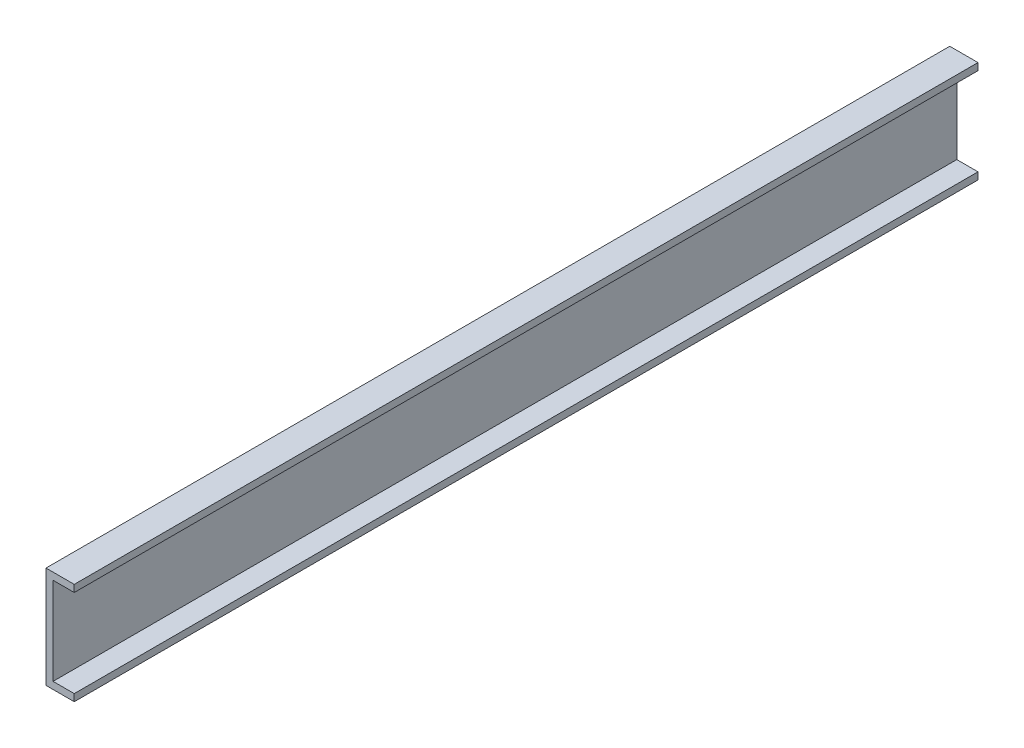
ISO-10303-21;
HEADER;
FILE_DESCRIPTION(('STEP AP214'),'2;1');
FILE_NAME('part.step','',(''),(''),'','','');
FILE_SCHEMA(('AUTOMOTIVE_DESIGN { 1 0 10303 214 1 1 1 1 }'));
ENDSEC;
DATA;
#1=APPLICATION_CONTEXT('core data for automotive mechanical design processes');
#2=APPLICATION_PROTOCOL_DEFINITION('international standard','automotive_design',2000,#1);
#3=PRODUCT_CONTEXT('',#1,'mechanical');
#4=PRODUCT('Part','Part','',(#3));
#5=PRODUCT_RELATED_PRODUCT_CATEGORY('part','',(#4));
#6=PRODUCT_DEFINITION_FORMATION('','',#4);
#7=PRODUCT_DEFINITION_CONTEXT('part definition',#1,'design');
#8=PRODUCT_DEFINITION('design','',#6,#7);
#9=PRODUCT_DEFINITION_SHAPE('','',#8);
#10=(LENGTH_UNIT() NAMED_UNIT(*) SI_UNIT(.MILLI.,.METRE.));
#11=(NAMED_UNIT(*) PLANE_ANGLE_UNIT() SI_UNIT($,.RADIAN.));
#12=(NAMED_UNIT(*) SI_UNIT($,.STERADIAN.) SOLID_ANGLE_UNIT());
#13=UNCERTAINTY_MEASURE_WITH_UNIT(LENGTH_MEASURE(1.E-05),#10,'distance_accuracy_value','');
#14=(GEOMETRIC_REPRESENTATION_CONTEXT(3) GLOBAL_UNCERTAINTY_ASSIGNED_CONTEXT((#13)) GLOBAL_UNIT_ASSIGNED_CONTEXT((#10,
#11,#12)) REPRESENTATION_CONTEXT('',''));
#15=CARTESIAN_POINT('',(0.,0.,0.));
#16=DIRECTION('',(0.,0.,1.));
#17=DIRECTION('',(1.,0.,0.));
#18=AXIS2_PLACEMENT_3D('',#15,#16,#17);
#19=CARTESIAN_POINT('',(12.7,0.,0.));
#20=DIRECTION('',(-1.,0.,0.));
#21=DIRECTION('',(0.,0.,1.));
#22=AXIS2_PLACEMENT_3D('',#19,#20,#21);
#23=PLANE('',#22);
#24=DIRECTION('',(0.,1.,0.));
#25=VECTOR('',#24,1.);
#26=CARTESIAN_POINT('',(12.7,0.,-406.4));
#27=LINE('',#26,#25);
#28=CARTESIAN_POINT('',(12.7,0.,-406.4));
#29=VERTEX_POINT('',#28);
#30=CARTESIAN_POINT('',(12.7,3.175,-406.4));
#31=VERTEX_POINT('',#30);
#32=EDGE_CURVE('E166',#29,#31,#27,.T.);
#33=ORIENTED_EDGE('',*,*,#32,.T.);
#34=DIRECTION('',(0.,0.,1.));
#35=VECTOR('',#34,1.);
#36=CARTESIAN_POINT('',(12.7,3.175,-406.4));
#37=LINE('',#36,#35);
#38=CARTESIAN_POINT('',(12.7,3.175,0.));
#39=VERTEX_POINT('',#38);
#40=EDGE_CURVE('E152',#31,#39,#37,.T.);
#41=ORIENTED_EDGE('',*,*,#40,.T.);
#42=DIRECTION('',(0.,-1.,0.));
#43=VECTOR('',#42,1.);
#44=CARTESIAN_POINT('',(12.7,0.,0.));
#45=LINE('',#44,#43);
#46=CARTESIAN_POINT('',(12.7,0.,0.));
#47=VERTEX_POINT('',#46);
#48=EDGE_CURVE('E93',#39,#47,#45,.T.);
#49=ORIENTED_EDGE('',*,*,#48,.T.);
#50=DIRECTION('',(0.,0.,-1.));
#51=VECTOR('',#50,1.);
#52=CARTESIAN_POINT('',(12.7,0.,0.));
#53=LINE('',#52,#51);
#54=EDGE_CURVE('E163',#47,#29,#53,.T.);
#55=ORIENTED_EDGE('',*,*,#54,.T.);
#56=EDGE_LOOP('',(#33,#41,#49,#55));
#57=FACE_BOUND('',#56,.T.);
#58=ADVANCED_FACE('F39',(#57),#23,.F.);
#59=CARTESIAN_POINT('',(12.7,0.,0.));
#60=DIRECTION('',(0.,0.,-1.));
#61=DIRECTION('',(-1.,0.,0.));
#62=AXIS2_PLACEMENT_3D('',#59,#60,#61);
#63=PLANE('',#62);
#64=ORIENTED_EDGE('',*,*,#48,.F.);
#65=DIRECTION('',(1.,0.,0.));
#66=VECTOR('',#65,1.);
#67=CARTESIAN_POINT('',(12.7,3.175,0.));
#68=LINE('',#67,#66);
#69=CARTESIAN_POINT('',(3.175,3.175,0.));
#70=VERTEX_POINT('',#69);
#71=EDGE_CURVE('E140',#70,#39,#68,.T.);
#72=ORIENTED_EDGE('',*,*,#71,.F.);
#73=DIRECTION('',(0.,-1.,0.));
#74=VECTOR('',#73,1.);
#75=CARTESIAN_POINT('',(3.175,42.545,0.));
#76=LINE('',#75,#74);
#77=CARTESIAN_POINT('',(3.175,42.545,0.));
#78=VERTEX_POINT('',#77);
#79=EDGE_CURVE('E143',#78,#70,#76,.T.);
#80=ORIENTED_EDGE('',*,*,#79,.F.);
#81=DIRECTION('',(-1.,0.,0.));
#82=VECTOR('',#81,1.);
#83=CARTESIAN_POINT('',(12.7,42.545,0.));
#84=LINE('',#83,#82);
#85=CARTESIAN_POINT('',(12.7,42.545,0.));
#86=VERTEX_POINT('',#85);
#87=EDGE_CURVE('E118',#86,#78,#84,.T.);
#88=ORIENTED_EDGE('',*,*,#87,.F.);
#89=CARTESIAN_POINT('',(12.7,45.72,0.));
#90=VERTEX_POINT('',#89);
#91=EDGE_CURVE('E160',#90,#86,#45,.T.);
#92=ORIENTED_EDGE('',*,*,#91,.F.);
#93=DIRECTION('',(-1.,0.,0.));
#94=VECTOR('',#93,1.);
#95=CARTESIAN_POINT('',(12.7,45.72,0.));
#96=LINE('',#95,#94);
#97=CARTESIAN_POINT('',(0.,45.72,0.));
#98=VERTEX_POINT('',#97);
#99=EDGE_CURVE('E172',#90,#98,#96,.T.);
#100=ORIENTED_EDGE('',*,*,#99,.T.);
#101=DIRECTION('',(0.,-1.,0.));
#102=VECTOR('',#101,1.);
#103=CARTESIAN_POINT('',(0.,0.,0.));
#104=LINE('',#103,#102);
#105=CARTESIAN_POINT('',(0.,0.,0.));
#106=VERTEX_POINT('',#105);
#107=EDGE_CURVE('E155',#98,#106,#104,.T.);
#108=ORIENTED_EDGE('',*,*,#107,.T.);
#109=DIRECTION('',(-1.,0.,0.));
#110=VECTOR('',#109,1.);
#111=CARTESIAN_POINT('',(12.7,0.,0.));
#112=LINE('',#111,#110);
#113=EDGE_CURVE('E11',#47,#106,#112,.T.);
#114=ORIENTED_EDGE('',*,*,#113,.F.);
#115=EDGE_LOOP('',(#64,#72,#80,#88,#92,#100,#108,#114));
#116=FACE_BOUND('',#115,.T.);
#117=ADVANCED_FACE('F41',(#116),#63,.F.);
#118=CARTESIAN_POINT('',(12.7,0.,0.));
#119=DIRECTION('',(0.,1.,0.));
#120=DIRECTION('',(0.,0.,1.));
#121=AXIS2_PLACEMENT_3D('',#118,#119,#120);
#122=PLANE('',#121);
#123=DIRECTION('',(0.,0.,-1.));
#124=VECTOR('',#123,1.);
#125=CARTESIAN_POINT('',(0.,0.,0.));
#126=LINE('',#125,#124);
#127=CARTESIAN_POINT('',(0.,0.,-406.4));
#128=VERTEX_POINT('',#127);
#129=EDGE_CURVE('E176',#106,#128,#126,.T.);
#130=ORIENTED_EDGE('',*,*,#129,.T.);
#131=DIRECTION('',(-1.,0.,0.));
#132=VECTOR('',#131,1.);
#133=CARTESIAN_POINT('',(12.7,0.,-406.4));
#134=LINE('',#133,#132);
#135=EDGE_CURVE('E48',#29,#128,#134,.T.);
#136=ORIENTED_EDGE('',*,*,#135,.F.);
#137=ORIENTED_EDGE('',*,*,#54,.F.);
#138=ORIENTED_EDGE('',*,*,#113,.T.);
#139=EDGE_LOOP('',(#130,#136,#137,#138));
#140=FACE_BOUND('',#139,.T.);
#141=ADVANCED_FACE('F209',(#140),#122,.F.);
#142=CARTESIAN_POINT('',(12.7,0.,-406.4));
#143=DIRECTION('',(0.,0.,1.));
#144=DIRECTION('',(1.,0.,0.));
#145=AXIS2_PLACEMENT_3D('',#142,#143,#144);
#146=PLANE('',#145);
#147=DIRECTION('',(0.,-1.,0.));
#148=VECTOR('',#147,1.);
#149=CARTESIAN_POINT('',(3.175,42.545,-406.4));
#150=LINE('',#149,#148);
#151=CARTESIAN_POINT('',(3.175,42.545,-406.4));
#152=VERTEX_POINT('',#151);
#153=CARTESIAN_POINT('',(3.175,3.175,-406.4));
#154=VERTEX_POINT('',#153);
#155=EDGE_CURVE('E127',#152,#154,#150,.T.);
#156=ORIENTED_EDGE('',*,*,#155,.T.);
#157=DIRECTION('',(1.,0.,0.));
#158=VECTOR('',#157,1.);
#159=CARTESIAN_POINT('',(12.7,3.175,-406.4));
#160=LINE('',#159,#158);
#161=EDGE_CURVE('E133',#154,#31,#160,.T.);
#162=ORIENTED_EDGE('',*,*,#161,.T.);
#163=ORIENTED_EDGE('',*,*,#32,.F.);
#164=ORIENTED_EDGE('',*,*,#135,.T.);
#165=DIRECTION('',(0.,1.,0.));
#166=VECTOR('',#165,1.);
#167=CARTESIAN_POINT('',(0.,0.,-406.4));
#168=LINE('',#167,#166);
#169=CARTESIAN_POINT('',(0.,45.72,-406.4));
#170=VERTEX_POINT('',#169);
#171=EDGE_CURVE('E179',#128,#170,#168,.T.);
#172=ORIENTED_EDGE('',*,*,#171,.T.);
#173=DIRECTION('',(-1.,0.,0.));
#174=VECTOR('',#173,1.);
#175=CARTESIAN_POINT('',(12.7,45.72,-406.4));
#176=LINE('',#175,#174);
#177=CARTESIAN_POINT('',(12.7,45.72,-406.4));
#178=VERTEX_POINT('',#177);
#179=EDGE_CURVE('E186',#178,#170,#176,.T.);
#180=ORIENTED_EDGE('',*,*,#179,.F.);
#181=CARTESIAN_POINT('',(12.7,42.545,-406.4));
#182=VERTEX_POINT('',#181);
#183=EDGE_CURVE('E138',#182,#178,#27,.T.);
#184=ORIENTED_EDGE('',*,*,#183,.F.);
#185=DIRECTION('',(-1.,0.,0.));
#186=VECTOR('',#185,1.);
#187=CARTESIAN_POINT('',(12.7,42.545,-406.4));
#188=LINE('',#187,#186);
#189=EDGE_CURVE('E55',#182,#152,#188,.T.);
#190=ORIENTED_EDGE('',*,*,#189,.T.);
#191=EDGE_LOOP('',(#156,#162,#163,#164,#172,#180,#184,#190));
#192=FACE_BOUND('',#191,.T.);
#193=ADVANCED_FACE('F136',(#192),#146,.F.);
#194=CARTESIAN_POINT('',(12.7,45.72,0.));
#195=DIRECTION('',(0.,-1.,0.));
#196=DIRECTION('',(0.,0.,-1.));
#197=AXIS2_PLACEMENT_3D('',#194,#195,#196);
#198=PLANE('',#197);
#199=DIRECTION('',(0.,0.,1.));
#200=VECTOR('',#199,1.);
#201=CARTESIAN_POINT('',(0.,45.72,0.));
#202=LINE('',#201,#200);
#203=EDGE_CURVE('E85',#170,#98,#202,.T.);
#204=ORIENTED_EDGE('',*,*,#203,.T.);
#205=ORIENTED_EDGE('',*,*,#99,.F.);
#206=DIRECTION('',(0.,0.,1.));
#207=VECTOR('',#206,1.);
#208=CARTESIAN_POINT('',(12.7,45.72,0.));
#209=LINE('',#208,#207);
#210=EDGE_CURVE('E64',#178,#90,#209,.T.);
#211=ORIENTED_EDGE('',*,*,#210,.F.);
#212=ORIENTED_EDGE('',*,*,#179,.T.);
#213=EDGE_LOOP('',(#204,#205,#211,#212));
#214=FACE_BOUND('',#213,.T.);
#215=ADVANCED_FACE('F200',(#214),#198,.F.);
#216=ORIENTED_EDGE('',*,*,#91,.T.);
#217=DIRECTION('',(0.,0.,1.));
#218=VECTOR('',#217,1.);
#219=CARTESIAN_POINT('',(12.7,42.545,-406.4));
#220=LINE('',#219,#218);
#221=EDGE_CURVE('E124',#182,#86,#220,.T.);
#222=ORIENTED_EDGE('',*,*,#221,.F.);
#223=ORIENTED_EDGE('',*,*,#183,.T.);
#224=ORIENTED_EDGE('',*,*,#210,.T.);
#225=EDGE_LOOP('',(#216,#222,#223,#224));
#226=FACE_BOUND('',#225,.T.);
#227=ADVANCED_FACE('F202',(#226),#23,.F.);
#228=CARTESIAN_POINT('',(0.,0.,0.));
#229=DIRECTION('',(-1.,0.,0.));
#230=DIRECTION('',(0.,0.,1.));
#231=AXIS2_PLACEMENT_3D('',#228,#229,#230);
#232=PLANE('',#231);
#233=ORIENTED_EDGE('',*,*,#107,.F.);
#234=ORIENTED_EDGE('',*,*,#203,.F.);
#235=ORIENTED_EDGE('',*,*,#171,.F.);
#236=ORIENTED_EDGE('',*,*,#129,.F.);
#237=EDGE_LOOP('',(#233,#234,#235,#236));
#238=FACE_BOUND('',#237,.T.);
#239=ADVANCED_FACE('F196',(#238),#232,.T.);
#240=CARTESIAN_POINT('',(12.7,3.175,-406.4));
#241=DIRECTION('',(0.,-1.,0.));
#242=DIRECTION('',(1.,0.,0.));
#243=AXIS2_PLACEMENT_3D('',#240,#241,#242);
#244=PLANE('',#243);
#245=ORIENTED_EDGE('',*,*,#71,.T.);
#246=ORIENTED_EDGE('',*,*,#40,.F.);
#247=ORIENTED_EDGE('',*,*,#161,.F.);
#248=DIRECTION('',(0.,0.,1.));
#249=VECTOR('',#248,1.);
#250=CARTESIAN_POINT('',(3.175,3.175,-406.4));
#251=LINE('',#250,#249);
#252=EDGE_CURVE('E123',#154,#70,#251,.T.);
#253=ORIENTED_EDGE('',*,*,#252,.T.);
#254=EDGE_LOOP('',(#245,#246,#247,#253));
#255=FACE_BOUND('',#254,.T.);
#256=ADVANCED_FACE('F219',(#255),#244,.F.);
#257=CARTESIAN_POINT('',(3.175,42.545,-406.4));
#258=DIRECTION('',(-1.,0.,0.));
#259=DIRECTION('',(0.,-1.,0.));
#260=AXIS2_PLACEMENT_3D('',#257,#258,#259);
#261=PLANE('',#260);
#262=ORIENTED_EDGE('',*,*,#79,.T.);
#263=ORIENTED_EDGE('',*,*,#252,.F.);
#264=ORIENTED_EDGE('',*,*,#155,.F.);
#265=DIRECTION('',(0.,0.,1.));
#266=VECTOR('',#265,1.);
#267=CARTESIAN_POINT('',(3.175,42.545,-406.4));
#268=LINE('',#267,#266);
#269=EDGE_CURVE('E114',#152,#78,#268,.T.);
#270=ORIENTED_EDGE('',*,*,#269,.T.);
#271=EDGE_LOOP('',(#262,#263,#264,#270));
#272=FACE_BOUND('',#271,.T.);
#273=ADVANCED_FACE('F128',(#272),#261,.F.);
#274=CARTESIAN_POINT('',(12.7,42.545,-406.4));
#275=DIRECTION('',(0.,1.,0.));
#276=DIRECTION('',(0.,0.,1.));
#277=AXIS2_PLACEMENT_3D('',#274,#275,#276);
#278=PLANE('',#277);
#279=ORIENTED_EDGE('',*,*,#87,.T.);
#280=ORIENTED_EDGE('',*,*,#269,.F.);
#281=ORIENTED_EDGE('',*,*,#189,.F.);
#282=ORIENTED_EDGE('',*,*,#221,.T.);
#283=EDGE_LOOP('',(#279,#280,#281,#282));
#284=FACE_BOUND('',#283,.T.);
#285=ADVANCED_FACE('F116',(#284),#278,.F.);
#286=CLOSED_SHELL('',(#58,#117,#141,#193,#215,#227,#239,#256,#273,#285));
#287=MANIFOLD_SOLID_BREP('B2',#286);
#288=ADVANCED_BREP_SHAPE_REPRESENTATION('',(#18,#287),#14);
#289=SHAPE_DEFINITION_REPRESENTATION(#9,#288);
ENDSEC;
END-ISO-10303-21;
